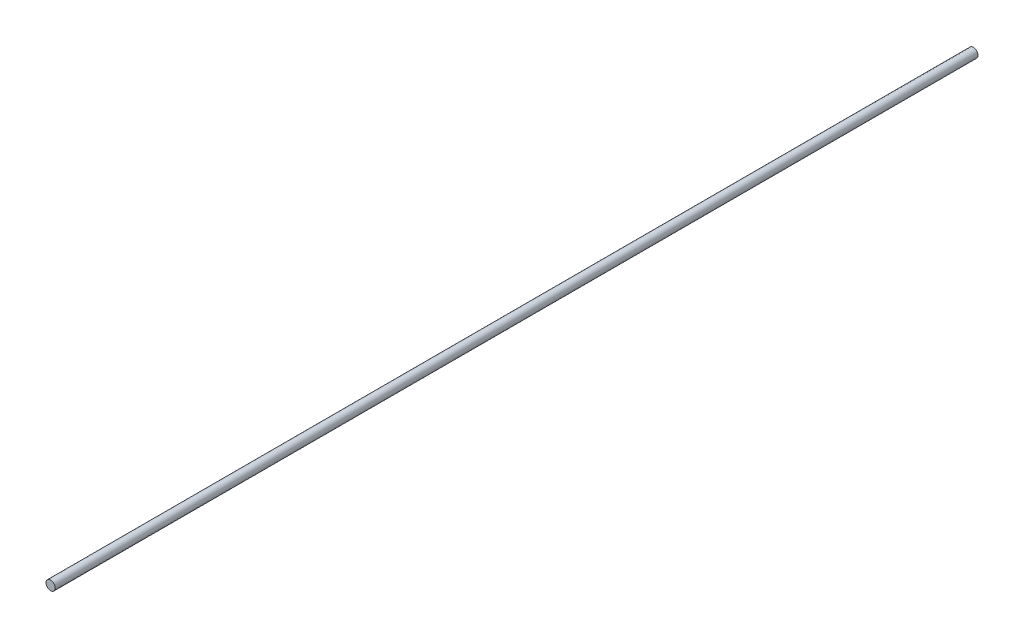
ISO-10303-21;
HEADER;
FILE_DESCRIPTION(('STEP AP214'),'2;1');
FILE_NAME('part.step','',(''),(''),'','','');
FILE_SCHEMA(('AUTOMOTIVE_DESIGN { 1 0 10303 214 1 1 1 1 }'));
ENDSEC;
DATA;
#1=APPLICATION_CONTEXT('core data for automotive mechanical design processes');
#2=APPLICATION_PROTOCOL_DEFINITION('international standard','automotive_design',2000,#1);
#3=PRODUCT_CONTEXT('',#1,'mechanical');
#4=PRODUCT('Part','Part','',(#3));
#5=PRODUCT_RELATED_PRODUCT_CATEGORY('part','',(#4));
#6=PRODUCT_DEFINITION_FORMATION('','',#4);
#7=PRODUCT_DEFINITION_CONTEXT('part definition',#1,'design');
#8=PRODUCT_DEFINITION('design','',#6,#7);
#9=PRODUCT_DEFINITION_SHAPE('','',#8);
#10=(LENGTH_UNIT() NAMED_UNIT(*) SI_UNIT(.MILLI.,.METRE.));
#11=(NAMED_UNIT(*) PLANE_ANGLE_UNIT() SI_UNIT($,.RADIAN.));
#12=(NAMED_UNIT(*) SI_UNIT($,.STERADIAN.) SOLID_ANGLE_UNIT());
#13=UNCERTAINTY_MEASURE_WITH_UNIT(LENGTH_MEASURE(1.E-05),#10,'distance_accuracy_value','');
#14=(GEOMETRIC_REPRESENTATION_CONTEXT(3) GLOBAL_UNCERTAINTY_ASSIGNED_CONTEXT((#13)) GLOBAL_UNIT_ASSIGNED_CONTEXT((#10,
#11,#12)) REPRESENTATION_CONTEXT('',''));
#15=CARTESIAN_POINT('',(0.,0.,0.));
#16=DIRECTION('',(0.,0.,1.));
#17=DIRECTION('',(1.,0.,0.));
#18=AXIS2_PLACEMENT_3D('',#15,#16,#17);
#19=CARTESIAN_POINT('',(0.,0.,5000.));
#20=DIRECTION('',(0.,0.,-1.));
#21=DIRECTION('',(-1.,0.,0.));
#22=AXIS2_PLACEMENT_3D('',#19,#20,#21);
#23=CYLINDRICAL_SURFACE('',#22,25.);
#24=CARTESIAN_POINT('',(0.,0.,5000.));
#25=DIRECTION('',(0.,0.,1.));
#26=DIRECTION('',(1.,0.,0.));
#27=AXIS2_PLACEMENT_3D('',#24,#25,#26);
#28=CIRCLE('',#27,25.);
#29=CARTESIAN_POINT('',(25.,0.,5000.));
#30=VERTEX_POINT('',#29);
#31=EDGE_CURVE('E10',#30,#30,#28,.T.);
#32=ORIENTED_EDGE('',*,*,#31,.F.);
#33=EDGE_LOOP('',(#32));
#34=FACE_BOUND('',#33,.T.);
#35=CARTESIAN_POINT('',(0.,0.,0.));
#36=DIRECTION('',(0.,0.,1.));
#37=DIRECTION('',(1.,0.,0.));
#38=AXIS2_PLACEMENT_3D('',#35,#36,#37);
#39=CIRCLE('',#38,25.);
#40=CARTESIAN_POINT('',(25.,0.,0.));
#41=VERTEX_POINT('',#40);
#42=EDGE_CURVE('E40',#41,#41,#39,.T.);
#43=ORIENTED_EDGE('',*,*,#42,.T.);
#44=EDGE_LOOP('',(#43));
#45=FACE_BOUND('',#44,.T.);
#46=ADVANCED_FACE('F37',(#34,#45),#23,.T.);
#47=CARTESIAN_POINT('',(0.,0.,5000.));
#48=DIRECTION('',(0.,0.,1.));
#49=DIRECTION('',(1.,0.,0.));
#50=AXIS2_PLACEMENT_3D('',#47,#48,#49);
#51=PLANE('',#50);
#52=ORIENTED_EDGE('',*,*,#31,.T.);
#53=EDGE_LOOP('',(#52));
#54=FACE_BOUND('',#53,.T.);
#55=ADVANCED_FACE('F54',(#54),#51,.T.);
#56=CARTESIAN_POINT('',(0.,0.,0.));
#57=DIRECTION('',(0.,0.,1.));
#58=DIRECTION('',(1.,0.,0.));
#59=AXIS2_PLACEMENT_3D('',#56,#57,#58);
#60=PLANE('',#59);
#61=ORIENTED_EDGE('',*,*,#42,.F.);
#62=EDGE_LOOP('',(#61));
#63=FACE_BOUND('',#62,.T.);
#64=ADVANCED_FACE('F52',(#63),#60,.F.);
#65=CLOSED_SHELL('',(#46,#55,#64));
#66=MANIFOLD_SOLID_BREP('B2',#65);
#67=ADVANCED_BREP_SHAPE_REPRESENTATION('',(#18,#66),#14);
#68=SHAPE_DEFINITION_REPRESENTATION(#9,#67);
ENDSEC;
END-ISO-10303-21;
